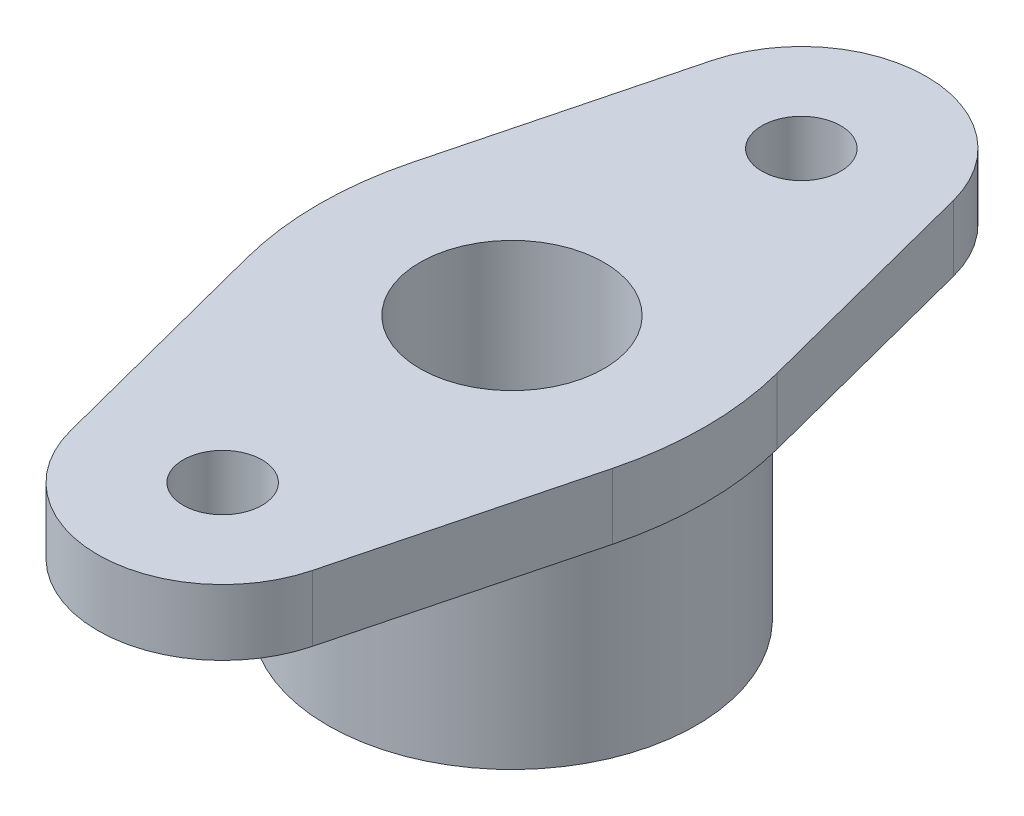
ISO-10303-21;
HEADER;
FILE_DESCRIPTION(('STEP AP214'),'2;1');
FILE_NAME('part.step','',(''),(''),'','','');
FILE_SCHEMA(('AUTOMOTIVE_DESIGN { 1 0 10303 214 1 1 1 1 }'));
ENDSEC;
DATA;
#1=APPLICATION_CONTEXT('core data for automotive mechanical design processes');
#2=APPLICATION_PROTOCOL_DEFINITION('international standard','automotive_design',2000,#1);
#3=PRODUCT_CONTEXT('',#1,'mechanical');
#4=PRODUCT('Part','Part','',(#3));
#5=PRODUCT_RELATED_PRODUCT_CATEGORY('part','',(#4));
#6=PRODUCT_DEFINITION_FORMATION('','',#4);
#7=PRODUCT_DEFINITION_CONTEXT('part definition',#1,'design');
#8=PRODUCT_DEFINITION('design','',#6,#7);
#9=PRODUCT_DEFINITION_SHAPE('','',#8);
#10=(LENGTH_UNIT() NAMED_UNIT(*) SI_UNIT(.MILLI.,.METRE.));
#11=(NAMED_UNIT(*) PLANE_ANGLE_UNIT() SI_UNIT($,.RADIAN.));
#12=(NAMED_UNIT(*) SI_UNIT($,.STERADIAN.) SOLID_ANGLE_UNIT());
#13=UNCERTAINTY_MEASURE_WITH_UNIT(LENGTH_MEASURE(1.E-05),#10,'distance_accuracy_value','');
#14=(GEOMETRIC_REPRESENTATION_CONTEXT(3) GLOBAL_UNCERTAINTY_ASSIGNED_CONTEXT((#13)) GLOBAL_UNIT_ASSIGNED_CONTEXT((#10,
#11,#12)) REPRESENTATION_CONTEXT('',''));
#15=CARTESIAN_POINT('',(0.,0.,0.));
#16=DIRECTION('',(0.,0.,1.));
#17=DIRECTION('',(1.,0.,0.));
#18=AXIS2_PLACEMENT_3D('',#15,#16,#17);
#19=CARTESIAN_POINT('',(-29.0578417959506,10.,7.51231827307484));
#20=DIRECTION('',(0.968168237112356,0.,-0.250300348874614));
#21=DIRECTION('',(-0.250300348874614,0.,-0.968168237112356));
#22=AXIS2_PLACEMENT_3D('',#19,#20,#21);
#23=PLANE('',#22);
#24=DIRECTION('',(0.250300348874614,0.,0.968168237112356));
#25=VECTOR('',#24,1.);
#26=CARTESIAN_POINT('',(-29.0578417959506,10.,7.51231827307484));
#27=LINE('',#26,#25);
#28=CARTESIAN_POINT('',(-27.7644949376973,10.,12.5150174437307));
#29=VERTEX_POINT('',#28);
#30=CARTESIAN_POINT('',(-18.3951965051348,10.,48.7557066286177));
#31=VERTEX_POINT('',#30);
#32=EDGE_CURVE('E99',#29,#31,#27,.T.);
#33=ORIENTED_EDGE('',*,*,#32,.F.);
#34=DIRECTION('',(0.,-1.,0.));
#35=VECTOR('',#34,1.);
#36=CARTESIAN_POINT('',(-27.7644949376973,0.,12.5150174437307));
#37=LINE('',#36,#35);
#38=CARTESIAN_POINT('',(-27.7644949376973,0.,12.5150174437307));
#39=VERTEX_POINT('',#38);
#40=EDGE_CURVE('E120',#29,#39,#37,.T.);
#41=ORIENTED_EDGE('',*,*,#40,.T.);
#42=DIRECTION('',(0.250300348874614,0.,0.968168237112356));
#43=VECTOR('',#42,1.);
#44=CARTESIAN_POINT('',(-29.0578417959506,0.,7.51231827307484));
#45=LINE('',#44,#43);
#46=CARTESIAN_POINT('',(-18.3951965051348,0.,48.7557066286177));
#47=VERTEX_POINT('',#46);
#48=EDGE_CURVE('E116',#39,#47,#45,.T.);
#49=ORIENTED_EDGE('',*,*,#48,.T.);
#50=DIRECTION('',(0.,-1.,0.));
#51=VECTOR('',#50,1.);
#52=CARTESIAN_POINT('',(-18.3951965051348,10.,48.7557066286177));
#53=LINE('',#52,#51);
#54=EDGE_CURVE('E114',#31,#47,#53,.T.);
#55=ORIENTED_EDGE('',*,*,#54,.F.);
#56=EDGE_LOOP('',(#33,#41,#49,#55));
#57=FACE_BOUND('',#56,.T.);
#58=ADVANCED_FACE('F35',(#57),#23,.F.);
#59=CARTESIAN_POINT('',(0.,10.,44.));
#60=DIRECTION('',(0.,-1.,0.));
#61=DIRECTION('',(0.,0.,-1.));
#62=AXIS2_PLACEMENT_3D('',#59,#60,#61);
#63=CYLINDRICAL_SURFACE('',#62,19.);
#64=CARTESIAN_POINT('',(0.,0.,44.));
#65=DIRECTION('',(0.,1.,0.));
#66=DIRECTION('',(0.,0.,1.));
#67=AXIS2_PLACEMENT_3D('',#64,#65,#66);
#68=CIRCLE('',#67,19.);
#69=CARTESIAN_POINT('',(18.3951965051348,0.,48.7557066286177));
#70=VERTEX_POINT('',#69);
#71=EDGE_CURVE('E146',#70,#47,#68,.F.);
#72=ORIENTED_EDGE('',*,*,#71,.F.);
#73=DIRECTION('',(0.,-1.,0.));
#74=VECTOR('',#73,1.);
#75=CARTESIAN_POINT('',(18.3951965051348,10.,48.7557066286177));
#76=LINE('',#75,#74);
#77=CARTESIAN_POINT('',(18.3951965051348,10.,48.7557066286177));
#78=VERTEX_POINT('',#77);
#79=EDGE_CURVE('E121',#78,#70,#76,.T.);
#80=ORIENTED_EDGE('',*,*,#79,.F.);
#81=CARTESIAN_POINT('',(0.,10.,44.));
#82=DIRECTION('',(0.,1.,0.));
#83=DIRECTION('',(0.,0.,1.));
#84=AXIS2_PLACEMENT_3D('',#81,#82,#83);
#85=CIRCLE('',#84,19.);
#86=EDGE_CURVE('E105',#78,#31,#85,.F.);
#87=ORIENTED_EDGE('',*,*,#86,.T.);
#88=ORIENTED_EDGE('',*,*,#54,.T.);
#89=EDGE_LOOP('',(#72,#80,#87,#88));
#90=FACE_BOUND('',#89,.T.);
#91=ADVANCED_FACE('F124',(#90),#63,.T.);
#92=CARTESIAN_POINT('',(29.0578417959506,10.,7.51231827307483));
#93=DIRECTION('',(0.968168237112356,0.,0.250300348874614));
#94=DIRECTION('',(0.250300348874614,0.,-0.968168237112356));
#95=AXIS2_PLACEMENT_3D('',#92,#93,#94);
#96=PLANE('',#95);
#97=DIRECTION('',(-0.250300348874614,0.,0.968168237112356));
#98=VECTOR('',#97,1.);
#99=CARTESIAN_POINT('',(29.0578417959506,0.,7.51231827307483));
#100=LINE('',#99,#98);
#101=CARTESIAN_POINT('',(27.7644949376973,0.,12.5150174437307));
#102=VERTEX_POINT('',#101);
#103=EDGE_CURVE('E149',#102,#70,#100,.T.);
#104=ORIENTED_EDGE('',*,*,#103,.F.);
#105=DIRECTION('',(0.,-1.,0.));
#106=VECTOR('',#105,1.);
#107=CARTESIAN_POINT('',(27.7644949376973,10.,12.5150174437307));
#108=LINE('',#107,#106);
#109=CARTESIAN_POINT('',(27.7644949376973,10.,12.5150174437307));
#110=VERTEX_POINT('',#109);
#111=EDGE_CURVE('E43',#102,#110,#108,.F.);
#112=ORIENTED_EDGE('',*,*,#111,.T.);
#113=DIRECTION('',(-0.250300348874614,0.,0.968168237112356));
#114=VECTOR('',#113,1.);
#115=CARTESIAN_POINT('',(29.0578417959506,10.,7.51231827307483));
#116=LINE('',#115,#114);
#117=EDGE_CURVE('E126',#110,#78,#116,.T.);
#118=ORIENTED_EDGE('',*,*,#117,.T.);
#119=ORIENTED_EDGE('',*,*,#79,.T.);
#120=EDGE_LOOP('',(#104,#112,#118,#119));
#121=FACE_BOUND('',#120,.T.);
#122=ADVANCED_FACE('F200',(#121),#96,.T.);
#123=CARTESIAN_POINT('',(29.0578417959506,10.,-7.51231827307483));
#124=DIRECTION('',(-0.968168237112356,0.,0.250300348874614));
#125=DIRECTION('',(0.250300348874614,0.,0.968168237112356));
#126=AXIS2_PLACEMENT_3D('',#123,#124,#125);
#127=PLANE('',#126);
#128=DIRECTION('',(-0.250300348874614,0.,-0.968168237112356));
#129=VECTOR('',#128,1.);
#130=CARTESIAN_POINT('',(29.0578417959506,10.,-7.51231827307483));
#131=LINE('',#130,#129);
#132=CARTESIAN_POINT('',(27.7644949376973,10.,-12.5150174437307));
#133=VERTEX_POINT('',#132);
#134=CARTESIAN_POINT('',(18.3951965051347,10.,-48.7557066286177));
#135=VERTEX_POINT('',#134);
#136=EDGE_CURVE('E128',#133,#135,#131,.T.);
#137=ORIENTED_EDGE('',*,*,#136,.F.);
#138=DIRECTION('',(0.,-1.,0.));
#139=VECTOR('',#138,1.);
#140=CARTESIAN_POINT('',(27.7644949376973,0.,-12.5150174437307));
#141=LINE('',#140,#139);
#142=CARTESIAN_POINT('',(27.7644949376973,0.,-12.5150174437307));
#143=VERTEX_POINT('',#142);
#144=EDGE_CURVE('E179',#133,#143,#141,.T.);
#145=ORIENTED_EDGE('',*,*,#144,.T.);
#146=DIRECTION('',(-0.250300348874614,0.,-0.968168237112356));
#147=VECTOR('',#146,1.);
#148=CARTESIAN_POINT('',(29.0578417959506,0.,-7.51231827307483));
#149=LINE('',#148,#147);
#150=CARTESIAN_POINT('',(18.3951965051347,0.,-48.7557066286177));
#151=VERTEX_POINT('',#150);
#152=EDGE_CURVE('E151',#143,#151,#149,.T.);
#153=ORIENTED_EDGE('',*,*,#152,.T.);
#154=DIRECTION('',(0.,-1.,0.));
#155=VECTOR('',#154,1.);
#156=CARTESIAN_POINT('',(18.3951965051347,10.,-48.7557066286177));
#157=LINE('',#156,#155);
#158=EDGE_CURVE('E166',#135,#151,#157,.T.);
#159=ORIENTED_EDGE('',*,*,#158,.F.);
#160=EDGE_LOOP('',(#137,#145,#153,#159));
#161=FACE_BOUND('',#160,.T.);
#162=ADVANCED_FACE('F184',(#161),#127,.F.);
#163=CARTESIAN_POINT('',(0.,10.,-44.));
#164=DIRECTION('',(0.,-1.,0.));
#165=DIRECTION('',(0.,0.,-1.));
#166=AXIS2_PLACEMENT_3D('',#163,#164,#165);
#167=CYLINDRICAL_SURFACE('',#166,19.);
#168=CARTESIAN_POINT('',(0.,0.,-44.));
#169=DIRECTION('',(0.,1.,0.));
#170=DIRECTION('',(0.,0.,1.));
#171=AXIS2_PLACEMENT_3D('',#168,#169,#170);
#172=CIRCLE('',#171,19.);
#173=CARTESIAN_POINT('',(-18.3951965051348,0.,-48.7557066286177));
#174=VERTEX_POINT('',#173);
#175=EDGE_CURVE('E153',#151,#174,#172,.T.);
#176=ORIENTED_EDGE('',*,*,#175,.T.);
#177=DIRECTION('',(0.,-1.,0.));
#178=VECTOR('',#177,1.);
#179=CARTESIAN_POINT('',(-18.3951965051348,10.,-48.7557066286177));
#180=LINE('',#179,#178);
#181=CARTESIAN_POINT('',(-18.3951965051348,10.,-48.7557066286177));
#182=VERTEX_POINT('',#181);
#183=EDGE_CURVE('E144',#182,#174,#180,.T.);
#184=ORIENTED_EDGE('',*,*,#183,.F.);
#185=CARTESIAN_POINT('',(0.,10.,-44.));
#186=DIRECTION('',(0.,1.,0.));
#187=DIRECTION('',(0.,0.,1.));
#188=AXIS2_PLACEMENT_3D('',#185,#186,#187);
#189=CIRCLE('',#188,19.);
#190=EDGE_CURVE('E133',#135,#182,#189,.T.);
#191=ORIENTED_EDGE('',*,*,#190,.F.);
#192=ORIENTED_EDGE('',*,*,#158,.T.);
#193=EDGE_LOOP('',(#176,#184,#191,#192));
#194=FACE_BOUND('',#193,.T.);
#195=ADVANCED_FACE('F194',(#194),#167,.T.);
#196=CARTESIAN_POINT('',(0.,10.,-44.));
#197=DIRECTION('',(0.,-1.,0.));
#198=DIRECTION('',(0.,0.,-1.));
#199=AXIS2_PLACEMENT_3D('',#196,#197,#198);
#200=CYLINDRICAL_SURFACE('',#199,6.);
#201=CARTESIAN_POINT('',(0.,10.,-44.));
#202=DIRECTION('',(0.,1.,0.));
#203=DIRECTION('',(0.,0.,1.));
#204=AXIS2_PLACEMENT_3D('',#201,#202,#203);
#205=CIRCLE('',#204,6.);
#206=CARTESIAN_POINT('',(0.,10.,-38.));
#207=VERTEX_POINT('',#206);
#208=EDGE_CURVE('E138',#207,#207,#205,.T.);
#209=ORIENTED_EDGE('',*,*,#208,.T.);
#210=EDGE_LOOP('',(#209));
#211=FACE_BOUND('',#210,.T.);
#212=CARTESIAN_POINT('',(0.,0.,-44.));
#213=DIRECTION('',(0.,1.,0.));
#214=DIRECTION('',(0.,0.,1.));
#215=AXIS2_PLACEMENT_3D('',#212,#213,#214);
#216=CIRCLE('',#215,6.);
#217=CARTESIAN_POINT('',(0.,0.,-38.));
#218=VERTEX_POINT('',#217);
#219=EDGE_CURVE('E158',#218,#218,#216,.T.);
#220=ORIENTED_EDGE('',*,*,#219,.F.);
#221=EDGE_LOOP('',(#220));
#222=FACE_BOUND('',#221,.T.);
#223=ADVANCED_FACE('F229',(#211,#222),#200,.F.);
#224=CARTESIAN_POINT('',(-29.0578417959506,10.,-7.51231827307483));
#225=DIRECTION('',(-0.968168237112356,0.,-0.250300348874614));
#226=DIRECTION('',(-0.250300348874614,0.,0.968168237112356));
#227=AXIS2_PLACEMENT_3D('',#224,#225,#226);
#228=PLANE('',#227);
#229=DIRECTION('',(0.250300348874614,0.,-0.968168237112356));
#230=VECTOR('',#229,1.);
#231=CARTESIAN_POINT('',(-29.0578417959506,0.,-7.51231827307483));
#232=LINE('',#231,#230);
#233=CARTESIAN_POINT('',(-27.7644949376973,0.,-12.5150174437307));
#234=VERTEX_POINT('',#233);
#235=EDGE_CURVE('E156',#234,#174,#232,.T.);
#236=ORIENTED_EDGE('',*,*,#235,.F.);
#237=DIRECTION('',(0.,-1.,0.));
#238=VECTOR('',#237,1.);
#239=CARTESIAN_POINT('',(-27.7644949376973,10.,-12.5150174437307));
#240=LINE('',#239,#238);
#241=CARTESIAN_POINT('',(-27.7644949376973,10.,-12.5150174437307));
#242=VERTEX_POINT('',#241);
#243=EDGE_CURVE('E175',#234,#242,#240,.F.);
#244=ORIENTED_EDGE('',*,*,#243,.T.);
#245=DIRECTION('',(0.250300348874614,0.,-0.968168237112356));
#246=VECTOR('',#245,1.);
#247=CARTESIAN_POINT('',(-29.0578417959506,10.,-7.51231827307483));
#248=LINE('',#247,#246);
#249=EDGE_CURVE('E136',#242,#182,#248,.T.);
#250=ORIENTED_EDGE('',*,*,#249,.T.);
#251=ORIENTED_EDGE('',*,*,#183,.T.);
#252=EDGE_LOOP('',(#236,#244,#250,#251));
#253=FACE_BOUND('',#252,.T.);
#254=ADVANCED_FACE('F221',(#253),#228,.T.);
#255=CARTESIAN_POINT('',(0.,10.,0.));
#256=DIRECTION('',(0.,-1.,0.));
#257=DIRECTION('',(0.,0.,-1.));
#258=AXIS2_PLACEMENT_3D('',#255,#256,#257);
#259=CYLINDRICAL_SURFACE('',#258,14.);
#260=CARTESIAN_POINT('',(0.,10.,0.));
#261=DIRECTION('',(0.,1.,0.));
#262=DIRECTION('',(0.,0.,1.));
#263=AXIS2_PLACEMENT_3D('',#260,#261,#262);
#264=CIRCLE('',#263,14.);
#265=CARTESIAN_POINT('',(0.,10.,14.));
#266=VERTEX_POINT('',#265);
#267=EDGE_CURVE('E111',#266,#266,#264,.T.);
#268=ORIENTED_EDGE('',*,*,#267,.T.);
#269=EDGE_LOOP('',(#268));
#270=FACE_BOUND('',#269,.T.);
#271=CARTESIAN_POINT('',(0.,-21.9170962313452,0.));
#272=DIRECTION('',(0.,1.,0.));
#273=DIRECTION('',(0.,0.,1.));
#274=AXIS2_PLACEMENT_3D('',#271,#272,#273);
#275=CIRCLE('',#274,14.);
#276=CARTESIAN_POINT('',(0.,-21.9170962313452,14.));
#277=VERTEX_POINT('',#276);
#278=EDGE_CURVE('E236',#277,#277,#275,.T.);
#279=ORIENTED_EDGE('',*,*,#278,.F.);
#280=EDGE_LOOP('',(#279));
#281=FACE_BOUND('',#280,.T.);
#282=ADVANCED_FACE('F218',(#270,#281),#259,.F.);
#283=CARTESIAN_POINT('',(0.,10.,44.));
#284=DIRECTION('',(0.,-1.,0.));
#285=DIRECTION('',(0.,0.,-1.));
#286=AXIS2_PLACEMENT_3D('',#283,#284,#285);
#287=CYLINDRICAL_SURFACE('',#286,6.);
#288=CARTESIAN_POINT('',(0.,10.,44.));
#289=DIRECTION('',(0.,1.,0.));
#290=DIRECTION('',(0.,0.,1.));
#291=AXIS2_PLACEMENT_3D('',#288,#289,#290);
#292=CIRCLE('',#291,6.);
#293=CARTESIAN_POINT('',(0.,10.,50.));
#294=VERTEX_POINT('',#293);
#295=EDGE_CURVE('E141',#294,#294,#292,.F.);
#296=ORIENTED_EDGE('',*,*,#295,.F.);
#297=EDGE_LOOP('',(#296));
#298=FACE_BOUND('',#297,.T.);
#299=CARTESIAN_POINT('',(0.,0.,44.));
#300=DIRECTION('',(0.,1.,0.));
#301=DIRECTION('',(0.,0.,1.));
#302=AXIS2_PLACEMENT_3D('',#299,#300,#301);
#303=CIRCLE('',#302,6.);
#304=CARTESIAN_POINT('',(0.,0.,50.));
#305=VERTEX_POINT('',#304);
#306=EDGE_CURVE('E161',#305,#305,#303,.F.);
#307=ORIENTED_EDGE('',*,*,#306,.T.);
#308=EDGE_LOOP('',(#307));
#309=FACE_BOUND('',#308,.T.);
#310=ADVANCED_FACE('F220',(#298,#309),#287,.F.);
#311=CARTESIAN_POINT('',(0.,10.,0.));
#312=DIRECTION('',(0.,1.,0.));
#313=DIRECTION('',(0.,0.,1.));
#314=AXIS2_PLACEMENT_3D('',#311,#312,#313);
#315=PLANE('',#314);
#316=ORIENTED_EDGE('',*,*,#267,.F.);
#317=EDGE_LOOP('',(#316));
#318=FACE_BOUND('',#317,.T.);
#319=ORIENTED_EDGE('',*,*,#249,.F.);
#320=CARTESIAN_POINT('',(20.6439169179204,10.,0.));
#321=DIRECTION('',(0.,1.,0.));
#322=DIRECTION('',(0.,0.,1.));
#323=AXIS2_PLACEMENT_3D('',#320,#321,#322);
#324=CIRCLE('',#323,50.);
#325=EDGE_CURVE('E107',#242,#29,#324,.T.);
#326=ORIENTED_EDGE('',*,*,#325,.T.);
#327=ORIENTED_EDGE('',*,*,#32,.T.);
#328=ORIENTED_EDGE('',*,*,#86,.F.);
#329=ORIENTED_EDGE('',*,*,#117,.F.);
#330=CARTESIAN_POINT('',(-20.6439169179205,10.,0.));
#331=DIRECTION('',(0.,1.,0.));
#332=DIRECTION('',(0.,0.,1.));
#333=AXIS2_PLACEMENT_3D('',#330,#331,#332);
#334=CIRCLE('',#333,50.);
#335=EDGE_CURVE('E50',#110,#133,#334,.T.);
#336=ORIENTED_EDGE('',*,*,#335,.T.);
#337=ORIENTED_EDGE('',*,*,#136,.T.);
#338=ORIENTED_EDGE('',*,*,#190,.T.);
#339=EDGE_LOOP('',(#319,#326,#327,#328,#329,#336,#337,#338));
#340=FACE_BOUND('',#339,.T.);
#341=ORIENTED_EDGE('',*,*,#208,.F.);
#342=EDGE_LOOP('',(#341));
#343=FACE_BOUND('',#342,.T.);
#344=ORIENTED_EDGE('',*,*,#295,.T.);
#345=EDGE_LOOP('',(#344));
#346=FACE_BOUND('',#345,.T.);
#347=ADVANCED_FACE('F102',(#318,#340,#343,#346),#315,.T.);
#348=CARTESIAN_POINT('',(0.,0.,0.));
#349=DIRECTION('',(0.,1.,0.));
#350=DIRECTION('',(0.,0.,1.));
#351=AXIS2_PLACEMENT_3D('',#348,#349,#350);
#352=PLANE('',#351);
#353=CARTESIAN_POINT('',(0.,0.,0.));
#354=DIRECTION('',(0.,1.,0.));
#355=DIRECTION('',(0.,0.,1.));
#356=AXIS2_PLACEMENT_3D('',#353,#354,#355);
#357=CIRCLE('',#356,28.);
#358=CARTESIAN_POINT('',(0.,0.,28.));
#359=VERTEX_POINT('',#358);
#360=EDGE_CURVE('E11',#359,#359,#357,.F.);
#361=ORIENTED_EDGE('',*,*,#360,.F.);
#362=EDGE_LOOP('',(#361));
#363=FACE_BOUND('',#362,.T.);
#364=ORIENTED_EDGE('',*,*,#48,.F.);
#365=CARTESIAN_POINT('',(20.6439169179204,0.,0.));
#366=DIRECTION('',(0.,1.,0.));
#367=DIRECTION('',(0.,0.,1.));
#368=AXIS2_PLACEMENT_3D('',#365,#366,#367);
#369=CIRCLE('',#368,50.);
#370=EDGE_CURVE('E173',#39,#234,#369,.F.);
#371=ORIENTED_EDGE('',*,*,#370,.T.);
#372=ORIENTED_EDGE('',*,*,#235,.T.);
#373=ORIENTED_EDGE('',*,*,#175,.F.);
#374=ORIENTED_EDGE('',*,*,#152,.F.);
#375=CARTESIAN_POINT('',(-20.6439169179205,0.,0.));
#376=DIRECTION('',(0.,1.,0.));
#377=DIRECTION('',(0.,0.,1.));
#378=AXIS2_PLACEMENT_3D('',#375,#376,#377);
#379=CIRCLE('',#378,50.);
#380=EDGE_CURVE('E171',#143,#102,#379,.F.);
#381=ORIENTED_EDGE('',*,*,#380,.T.);
#382=ORIENTED_EDGE('',*,*,#103,.T.);
#383=ORIENTED_EDGE('',*,*,#71,.T.);
#384=EDGE_LOOP('',(#364,#371,#372,#373,#374,#381,#382,#383));
#385=FACE_BOUND('',#384,.T.);
#386=ORIENTED_EDGE('',*,*,#219,.T.);
#387=EDGE_LOOP('',(#386));
#388=FACE_BOUND('',#387,.T.);
#389=ORIENTED_EDGE('',*,*,#306,.F.);
#390=EDGE_LOOP('',(#389));
#391=FACE_BOUND('',#390,.T.);
#392=ADVANCED_FACE('F189',(#363,#385,#388,#391),#352,.F.);
#393=CARTESIAN_POINT('',(20.6439169179204,10.,0.));
#394=DIRECTION('',(0.,1.,0.));
#395=DIRECTION('',(0.,0.,1.));
#396=AXIS2_PLACEMENT_3D('',#393,#394,#395);
#397=CYLINDRICAL_SURFACE('',#396,50.);
#398=ORIENTED_EDGE('',*,*,#325,.F.);
#399=ORIENTED_EDGE('',*,*,#243,.F.);
#400=ORIENTED_EDGE('',*,*,#370,.F.);
#401=ORIENTED_EDGE('',*,*,#40,.F.);
#402=EDGE_LOOP('',(#398,#399,#400,#401));
#403=FACE_BOUND('',#402,.T.);
#404=ADVANCED_FACE('F199',(#403),#397,.T.);
#405=CARTESIAN_POINT('',(-20.6439169179205,10.,0.));
#406=DIRECTION('',(0.,1.,0.));
#407=DIRECTION('',(0.,0.,1.));
#408=AXIS2_PLACEMENT_3D('',#405,#406,#407);
#409=CYLINDRICAL_SURFACE('',#408,50.);
#410=ORIENTED_EDGE('',*,*,#335,.F.);
#411=ORIENTED_EDGE('',*,*,#111,.F.);
#412=ORIENTED_EDGE('',*,*,#380,.F.);
#413=ORIENTED_EDGE('',*,*,#144,.F.);
#414=EDGE_LOOP('',(#410,#411,#412,#413));
#415=FACE_BOUND('',#414,.T.);
#416=ADVANCED_FACE('F37',(#415),#409,.T.);
#417=CARTESIAN_POINT('',(0.,0.,0.));
#418=DIRECTION('',(0.,1.,0.));
#419=DIRECTION('',(0.,0.,1.));
#420=AXIS2_PLACEMENT_3D('',#417,#418,#419);
#421=CYLINDRICAL_SURFACE('',#420,28.);
#422=ORIENTED_EDGE('',*,*,#360,.T.);
#423=EDGE_LOOP('',(#422));
#424=FACE_BOUND('',#423,.T.);
#425=CARTESIAN_POINT('',(0.,-30.,0.));
#426=DIRECTION('',(0.,1.,0.));
#427=DIRECTION('',(0.,0.,1.));
#428=AXIS2_PLACEMENT_3D('',#425,#426,#427);
#429=CIRCLE('',#428,28.);
#430=CARTESIAN_POINT('',(0.,-30.,28.));
#431=VERTEX_POINT('',#430);
#432=EDGE_CURVE('E147',#431,#431,#429,.T.);
#433=ORIENTED_EDGE('',*,*,#432,.T.);
#434=EDGE_LOOP('',(#433));
#435=FACE_BOUND('',#434,.T.);
#436=ADVANCED_FACE('F202',(#424,#435),#421,.T.);
#437=CARTESIAN_POINT('',(0.,-21.9170962313452,0.));
#438=DIRECTION('',(0.,-1.,0.));
#439=DIRECTION('',(0.,0.,-1.));
#440=AXIS2_PLACEMENT_3D('',#437,#438,#439);
#441=CONICAL_SURFACE('',#440,14.,1.04719755119659);
#442=ORIENTED_EDGE('',*,*,#432,.F.);
#443=EDGE_LOOP('',(#442));
#444=FACE_BOUND('',#443,.T.);
#445=ORIENTED_EDGE('',*,*,#278,.T.);
#446=EDGE_LOOP('',(#445));
#447=FACE_BOUND('',#446,.T.);
#448=ADVANCED_FACE('F207',(#444,#447),#441,.F.);
#449=CLOSED_SHELL('',(#58,#91,#122,#162,#195,#223,#254,#282,#310,#347,#392,#404,#416,#436,#448));
#450=MANIFOLD_SOLID_BREP('B2',#449);
#451=ADVANCED_BREP_SHAPE_REPRESENTATION('',(#18,#450),#14);
#452=SHAPE_DEFINITION_REPRESENTATION(#9,#451);
ENDSEC;
END-ISO-10303-21;
